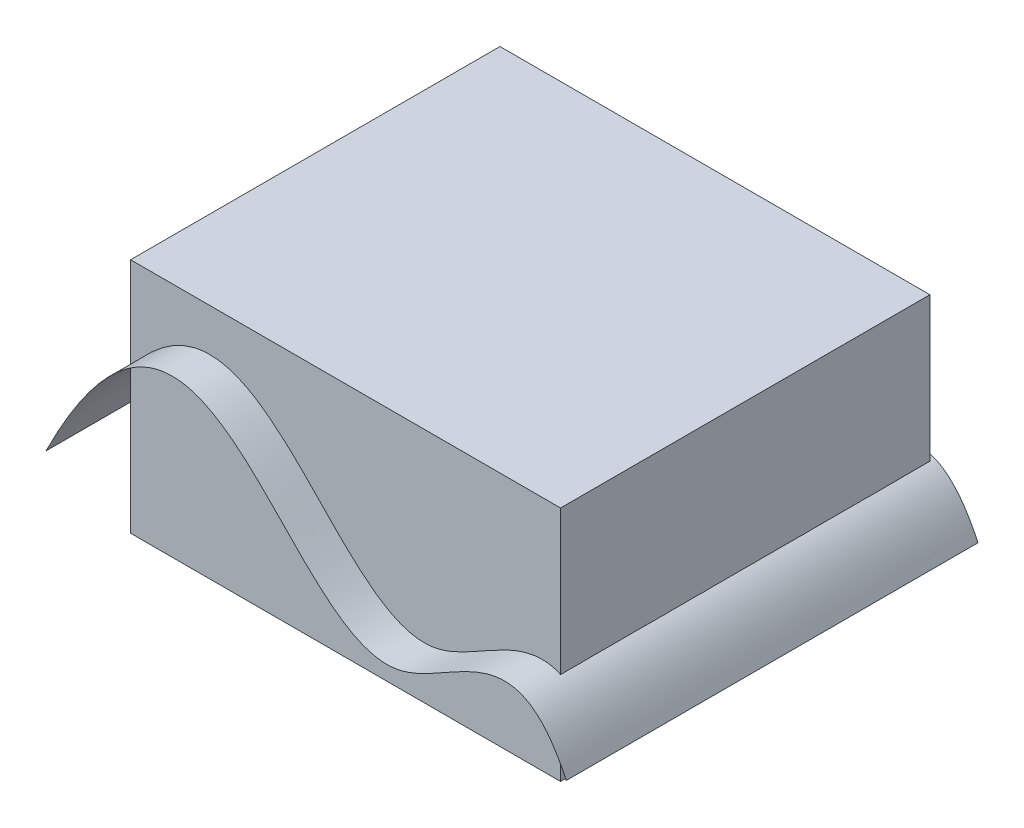
ISO-10303-21;
HEADER;
FILE_DESCRIPTION(('STEP AP214'),'2;1');
FILE_NAME('part.step','',(''),(''),'','','');
FILE_SCHEMA(('AUTOMOTIVE_DESIGN { 1 0 10303 214 1 1 1 1 }'));
ENDSEC;
DATA;
#1=APPLICATION_CONTEXT('core data for automotive mechanical design processes');
#2=APPLICATION_PROTOCOL_DEFINITION('international standard','automotive_design',2000,#1);
#3=PRODUCT_CONTEXT('',#1,'mechanical');
#4=PRODUCT('Part','Part','',(#3));
#5=PRODUCT_RELATED_PRODUCT_CATEGORY('part','',(#4));
#6=PRODUCT_DEFINITION_FORMATION('','',#4);
#7=PRODUCT_DEFINITION_CONTEXT('part definition',#1,'design');
#8=PRODUCT_DEFINITION('design','',#6,#7);
#9=PRODUCT_DEFINITION_SHAPE('','',#8);
#10=(LENGTH_UNIT() NAMED_UNIT(*) SI_UNIT(.MILLI.,.METRE.));
#11=(NAMED_UNIT(*) PLANE_ANGLE_UNIT() SI_UNIT($,.RADIAN.));
#12=(NAMED_UNIT(*) SI_UNIT($,.STERADIAN.) SOLID_ANGLE_UNIT());
#13=UNCERTAINTY_MEASURE_WITH_UNIT(LENGTH_MEASURE(1.E-05),#10,'distance_accuracy_value','');
#14=(GEOMETRIC_REPRESENTATION_CONTEXT(3) GLOBAL_UNCERTAINTY_ASSIGNED_CONTEXT((#13)) GLOBAL_UNIT_ASSIGNED_CONTEXT((#10,
#11,#12)) REPRESENTATION_CONTEXT('',''));
#15=CARTESIAN_POINT('',(0.,0.,0.));
#16=DIRECTION('',(0.,0.,1.));
#17=DIRECTION('',(1.,0.,0.));
#18=AXIS2_PLACEMENT_3D('',#15,#16,#17);
#19=CARTESIAN_POINT('',(-88.9503624856376,22.5454685632026,62.6633162704457));
#20=CARTESIAN_POINT('',(-37.8141386567155,125.215292475116,62.6633162704457));
#21=CARTESIAN_POINT('',(5.84947542840995,-43.7179988687432,62.6633162704457));
#22=CARTESIAN_POINT('',(69.6437169043807,52.4820397279148,62.6633162704457));
#23=CARTESIAN_POINT('',(87.5841174456941,13.9727510125804,62.6633162704457));
#24=B_SPLINE_CURVE_WITH_KNOTS('',3,(#19,#20,#21,#22,#23),.UNSPECIFIED.,.F.,.F.,(4,1,4),(0.,
0.6650166527823,1.),.UNSPECIFIED.);
#25=DIRECTION('',(0.,0.,-1.));
#26=VECTOR('',#25,1.);
#27=SURFACE_OF_LINEAR_EXTRUSION('',#24,#26);
#28=CARTESIAN_POINT('',(-88.9503624856376,22.5454685632026,-64.3366837295543));
#29=CARTESIAN_POINT('',(-37.8141386567155,125.215292475116,-64.3366837295543));
#30=CARTESIAN_POINT('',(5.84947542840995,-43.7179988687432,-64.3366837295543));
#31=CARTESIAN_POINT('',(69.6437169043807,52.4820397279148,-64.3366837295543));
#32=CARTESIAN_POINT('',(87.5841174456941,13.9727510125804,-64.3366837295543));
#33=B_SPLINE_CURVE_WITH_KNOTS('',3,(#28,#29,#30,#31,#32),.UNSPECIFIED.,.F.,.F.,(4,1,4),(0.,
0.6650166527823,1.),.UNSPECIFIED.);
#34=CARTESIAN_POINT('',(-88.9503624856376,22.5454685632026,-64.3366837295543));
#35=VERTEX_POINT('',#34);
#36=CARTESIAN_POINT('',(87.5841174456941,13.9727510125804,-64.3366837295543));
#37=VERTEX_POINT('',#36);
#38=EDGE_CURVE('E56',#35,#37,#33,.T.);
#39=ORIENTED_EDGE('',*,*,#38,.F.);
#40=DIRECTION('',(0.,0.,-1.));
#41=VECTOR('',#40,1.);
#42=CARTESIAN_POINT('',(-88.9503624856376,22.5454685632026,62.6633162704457));
#43=LINE('',#42,#41);
#44=CARTESIAN_POINT('',(-88.9503624856376,22.5454685632026,75.3633162704457));
#45=VERTEX_POINT('',#44);
#46=EDGE_CURVE('E48',#45,#35,#43,.T.);
#47=ORIENTED_EDGE('',*,*,#46,.F.);
#48=CARTESIAN_POINT('',(-88.9503624856376,22.5454685632026,75.3633162704457));
#49=CARTESIAN_POINT('',(-37.8141386567155,125.215292475116,75.3633162704457));
#50=CARTESIAN_POINT('',(5.84947542840995,-43.7179988687432,75.3633162704457));
#51=CARTESIAN_POINT('',(69.6437169043807,52.4820397279148,75.3633162704457));
#52=CARTESIAN_POINT('',(87.5841174456941,13.9727510125804,75.3633162704457));
#53=B_SPLINE_CURVE_WITH_KNOTS('',3,(#48,#49,#50,#51,#52),.UNSPECIFIED.,.F.,.F.,(4,1,4),(0.,
0.6650166527823,1.),.UNSPECIFIED.);
#54=CARTESIAN_POINT('',(87.5841174456941,13.9727510125804,75.3633162704457));
#55=VERTEX_POINT('',#54);
#56=EDGE_CURVE('E66',#45,#55,#53,.T.);
#57=ORIENTED_EDGE('',*,*,#56,.T.);
#58=DIRECTION('',(0.,0.,-1.));
#59=VECTOR('',#58,1.);
#60=CARTESIAN_POINT('',(87.5841174456941,13.9727510125804,62.6633162704457));
#61=LINE('',#60,#59);
#62=EDGE_CURVE('E12',#55,#37,#61,.T.);
#63=ORIENTED_EDGE('',*,*,#62,.T.);
#64=EDGE_LOOP('',(#39,#47,#57,#63));
#65=FACE_BOUND('',#64,.T.);
#66=ADVANCED_FACE('F46',(#65),#27,.T.);
#67=OPEN_SHELL('',(#66));
#68=SHELL_BASED_SURFACE_MODEL('B2',(#67));
#69=CARTESIAN_POINT('',(72.9401001387988,80.3747042919709,62.6633162704457));
#70=DIRECTION('',(-1.,0.,0.));
#71=DIRECTION('',(0.,0.,1.));
#72=AXIS2_PLACEMENT_3D('',#69,#70,#71);
#73=PLANE('',#72);
#74=DIRECTION('',(0.,0.,-1.));
#75=VECTOR('',#74,1.);
#76=CARTESIAN_POINT('',(72.9401001387988,0.,62.6633162704457));
#77=LINE('',#76,#75);
#78=CARTESIAN_POINT('',(72.9401001387988,0.,62.6633162704457));
#79=VERTEX_POINT('',#78);
#80=CARTESIAN_POINT('',(72.9401001387988,0.,-62.6633162704457));
#81=VERTEX_POINT('',#80);
#82=EDGE_CURVE('E169',#79,#81,#77,.T.);
#83=ORIENTED_EDGE('',*,*,#82,.T.);
#84=DIRECTION('',(0.,-1.,0.));
#85=VECTOR('',#84,1.);
#86=CARTESIAN_POINT('',(72.9401001387988,80.3747042919709,-62.6633162704457));
#87=LINE('',#86,#85);
#88=CARTESIAN_POINT('',(72.9401001387988,80.3747042919709,-62.6633162704457));
#89=VERTEX_POINT('',#88);
#90=EDGE_CURVE('E44',#89,#81,#87,.T.);
#91=ORIENTED_EDGE('',*,*,#90,.F.);
#92=DIRECTION('',(0.,0.,-1.));
#93=VECTOR('',#92,1.);
#94=CARTESIAN_POINT('',(72.9401001387988,80.3747042919709,62.6633162704457));
#95=LINE('',#94,#93);
#96=CARTESIAN_POINT('',(72.9401001387988,80.3747042919709,62.6633162704457));
#97=VERTEX_POINT('',#96);
#98=EDGE_CURVE('E157',#97,#89,#95,.T.);
#99=ORIENTED_EDGE('',*,*,#98,.F.);
#100=DIRECTION('',(0.,-1.,0.));
#101=VECTOR('',#100,1.);
#102=CARTESIAN_POINT('',(72.9401001387988,80.3747042919709,62.6633162704457));
#103=LINE('',#102,#101);
#104=EDGE_CURVE('E165',#97,#79,#103,.T.);
#105=ORIENTED_EDGE('',*,*,#104,.T.);
#106=EDGE_LOOP('',(#83,#91,#99,#105));
#107=FACE_BOUND('',#106,.T.);
#108=ADVANCED_FACE('F106',(#107),#73,.F.);
#109=CARTESIAN_POINT('',(-72.9401001387988,80.3747042919709,-62.6633162704457));
#110=DIRECTION('',(0.,0.,1.));
#111=DIRECTION('',(1.,0.,0.));
#112=AXIS2_PLACEMENT_3D('',#109,#110,#111);
#113=PLANE('',#112);
#114=DIRECTION('',(-1.,0.,0.));
#115=VECTOR('',#114,1.);
#116=CARTESIAN_POINT('',(-72.9401001387988,0.,-62.6633162704457));
#117=LINE('',#116,#115);
#118=CARTESIAN_POINT('',(-72.9401001387988,0.,-62.6633162704457));
#119=VERTEX_POINT('',#118);
#120=EDGE_CURVE('E161',#81,#119,#117,.T.);
#121=ORIENTED_EDGE('',*,*,#120,.T.);
#122=DIRECTION('',(0.,-1.,0.));
#123=VECTOR('',#122,1.);
#124=CARTESIAN_POINT('',(-72.9401001387988,80.3747042919709,-62.6633162704457));
#125=LINE('',#124,#123);
#126=CARTESIAN_POINT('',(-72.9401001387988,80.3747042919709,-62.6633162704457));
#127=VERTEX_POINT('',#126);
#128=EDGE_CURVE('E114',#127,#119,#125,.T.);
#129=ORIENTED_EDGE('',*,*,#128,.F.);
#130=DIRECTION('',(-1.,0.,0.));
#131=VECTOR('',#130,1.);
#132=CARTESIAN_POINT('',(-72.9401001387988,80.3747042919709,-62.6633162704457));
#133=LINE('',#132,#131);
#134=EDGE_CURVE('E152',#89,#127,#133,.T.);
#135=ORIENTED_EDGE('',*,*,#134,.F.);
#136=ORIENTED_EDGE('',*,*,#90,.T.);
#137=EDGE_LOOP('',(#121,#129,#135,#136));
#138=FACE_BOUND('',#137,.T.);
#139=ADVANCED_FACE('F160',(#138),#113,.F.);
#140=CARTESIAN_POINT('',(-72.9401001387988,80.3747042919709,62.6633162704457));
#141=DIRECTION('',(1.,0.,0.));
#142=DIRECTION('',(0.,0.,-1.));
#143=AXIS2_PLACEMENT_3D('',#140,#141,#142);
#144=PLANE('',#143);
#145=DIRECTION('',(0.,0.,1.));
#146=VECTOR('',#145,1.);
#147=CARTESIAN_POINT('',(-72.9401001387988,0.,62.6633162704457));
#148=LINE('',#147,#146);
#149=CARTESIAN_POINT('',(-72.9401001387988,0.,62.6633162704457));
#150=VERTEX_POINT('',#149);
#151=EDGE_CURVE('E139',#119,#150,#148,.T.);
#152=ORIENTED_EDGE('',*,*,#151,.T.);
#153=DIRECTION('',(0.,-1.,0.));
#154=VECTOR('',#153,1.);
#155=CARTESIAN_POINT('',(-72.9401001387988,80.3747042919709,62.6633162704457));
#156=LINE('',#155,#154);
#157=CARTESIAN_POINT('',(-72.9401001387988,80.3747042919709,62.6633162704457));
#158=VERTEX_POINT('',#157);
#159=EDGE_CURVE('E162',#158,#150,#156,.T.);
#160=ORIENTED_EDGE('',*,*,#159,.F.);
#161=DIRECTION('',(0.,0.,1.));
#162=VECTOR('',#161,1.);
#163=CARTESIAN_POINT('',(-72.9401001387988,80.3747042919709,62.6633162704457));
#164=LINE('',#163,#162);
#165=EDGE_CURVE('E155',#127,#158,#164,.T.);
#166=ORIENTED_EDGE('',*,*,#165,.F.);
#167=ORIENTED_EDGE('',*,*,#128,.T.);
#168=EDGE_LOOP('',(#152,#160,#166,#167));
#169=FACE_BOUND('',#168,.T.);
#170=ADVANCED_FACE('F163',(#169),#144,.F.);
#171=CARTESIAN_POINT('',(-72.9401001387988,80.3747042919709,62.6633162704457));
#172=DIRECTION('',(0.,0.,-1.));
#173=DIRECTION('',(-1.,0.,0.));
#174=AXIS2_PLACEMENT_3D('',#171,#172,#173);
#175=PLANE('',#174);
#176=DIRECTION('',(1.,0.,0.));
#177=VECTOR('',#176,1.);
#178=CARTESIAN_POINT('',(-72.9401001387988,0.,62.6633162704457));
#179=LINE('',#178,#177);
#180=EDGE_CURVE('E145',#150,#79,#179,.T.);
#181=ORIENTED_EDGE('',*,*,#180,.T.);
#182=ORIENTED_EDGE('',*,*,#104,.F.);
#183=DIRECTION('',(1.,0.,0.));
#184=VECTOR('',#183,1.);
#185=CARTESIAN_POINT('',(-72.9401001387988,80.3747042919709,62.6633162704457));
#186=LINE('',#185,#184);
#187=EDGE_CURVE('E122',#158,#97,#186,.T.);
#188=ORIENTED_EDGE('',*,*,#187,.F.);
#189=ORIENTED_EDGE('',*,*,#159,.T.);
#190=EDGE_LOOP('',(#181,#182,#188,#189));
#191=FACE_BOUND('',#190,.T.);
#192=ADVANCED_FACE('F176',(#191),#175,.F.);
#193=CARTESIAN_POINT('',(0.,80.3747042919709,0.));
#194=DIRECTION('',(0.,-1.,0.));
#195=DIRECTION('',(0.,0.,-1.));
#196=AXIS2_PLACEMENT_3D('',#193,#194,#195);
#197=PLANE('',#196);
#198=ORIENTED_EDGE('',*,*,#98,.T.);
#199=ORIENTED_EDGE('',*,*,#134,.T.);
#200=ORIENTED_EDGE('',*,*,#165,.T.);
#201=ORIENTED_EDGE('',*,*,#187,.T.);
#202=EDGE_LOOP('',(#198,#199,#200,#201));
#203=FACE_BOUND('',#202,.T.);
#204=ADVANCED_FACE('F153',(#203),#197,.F.);
#205=CARTESIAN_POINT('',(0.,0.,0.));
#206=DIRECTION('',(0.,-1.,0.));
#207=DIRECTION('',(0.,0.,-1.));
#208=AXIS2_PLACEMENT_3D('',#205,#206,#207);
#209=PLANE('',#208);
#210=ORIENTED_EDGE('',*,*,#82,.F.);
#211=ORIENTED_EDGE('',*,*,#180,.F.);
#212=ORIENTED_EDGE('',*,*,#151,.F.);
#213=ORIENTED_EDGE('',*,*,#120,.F.);
#214=EDGE_LOOP('',(#210,#211,#212,#213));
#215=FACE_BOUND('',#214,.T.);
#216=ADVANCED_FACE('F179',(#215),#209,.T.);
#217=CLOSED_SHELL('',(#108,#139,#170,#192,#204,#216));
#218=MANIFOLD_SOLID_BREP('B6',#217);
#219=ADVANCED_BREP_SHAPE_REPRESENTATION('',(#18,#218),#14);
#220=MANIFOLD_SURFACE_SHAPE_REPRESENTATION('',(#18,#68),#14);
#221=SHAPE_REPRESENTATION('',(#18),#14);
#222=SHAPE_DEFINITION_REPRESENTATION(#9,#221);
#223=SHAPE_REPRESENTATION_RELATIONSHIP('','',#221,#219);
#224=SHAPE_REPRESENTATION_RELATIONSHIP('','',#221,#220);
ENDSEC;
END-ISO-10303-21;
